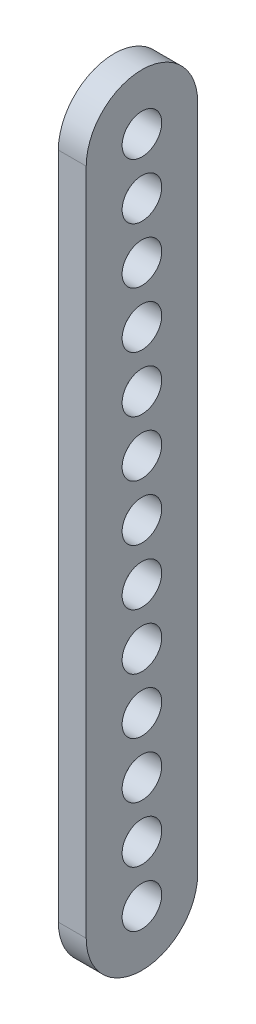
ISO-10303-21;
HEADER;
FILE_DESCRIPTION(('STEP AP214'),'2;1');
FILE_NAME('part.step','',(''),(''),'','','');
FILE_SCHEMA(('AUTOMOTIVE_DESIGN { 1 0 10303 214 1 1 1 1 }'));
ENDSEC;
DATA;
#1=APPLICATION_CONTEXT('core data for automotive mechanical design processes');
#2=APPLICATION_PROTOCOL_DEFINITION('international standard','automotive_design',2000,#1);
#3=PRODUCT_CONTEXT('',#1,'mechanical');
#4=PRODUCT('Part','Part','',(#3));
#5=PRODUCT_RELATED_PRODUCT_CATEGORY('part','',(#4));
#6=PRODUCT_DEFINITION_FORMATION('','',#4);
#7=PRODUCT_DEFINITION_CONTEXT('part definition',#1,'design');
#8=PRODUCT_DEFINITION('design','',#6,#7);
#9=PRODUCT_DEFINITION_SHAPE('','',#8);
#10=(LENGTH_UNIT() NAMED_UNIT(*) SI_UNIT(.MILLI.,.METRE.));
#11=(NAMED_UNIT(*) PLANE_ANGLE_UNIT() SI_UNIT($,.RADIAN.));
#12=(NAMED_UNIT(*) SI_UNIT($,.STERADIAN.) SOLID_ANGLE_UNIT());
#13=UNCERTAINTY_MEASURE_WITH_UNIT(LENGTH_MEASURE(1.E-05),#10,'distance_accuracy_value','');
#14=(GEOMETRIC_REPRESENTATION_CONTEXT(3) GLOBAL_UNCERTAINTY_ASSIGNED_CONTEXT((#13)) GLOBAL_UNIT_ASSIGNED_CONTEXT((#10,
#11,#12)) REPRESENTATION_CONTEXT('',''));
#15=CARTESIAN_POINT('',(0.,0.,0.));
#16=DIRECTION('',(0.,0.,1.));
#17=DIRECTION('',(1.,0.,0.));
#18=AXIS2_PLACEMENT_3D('',#15,#16,#17);
#19=CARTESIAN_POINT('',(2.5,30.,0.));
#20=DIRECTION('',(-1.,0.,0.));
#21=DIRECTION('',(0.,0.,1.));
#22=AXIS2_PLACEMENT_3D('',#19,#20,#21);
#23=CYLINDRICAL_SURFACE('',#22,5.);
#24=CARTESIAN_POINT('',(0.,30.,0.));
#25=DIRECTION('',(1.,0.,0.));
#26=DIRECTION('',(0.,0.,-1.));
#27=AXIS2_PLACEMENT_3D('',#24,#25,#26);
#28=CIRCLE('',#27,5.);
#29=CARTESIAN_POINT('',(0.,30.,-4.99999999999999));
#30=VERTEX_POINT('',#29);
#31=CARTESIAN_POINT('',(0.,30.,5.00000000000001));
#32=VERTEX_POINT('',#31);
#33=EDGE_CURVE('E107',#30,#32,#28,.T.);
#34=ORIENTED_EDGE('',*,*,#33,.T.);
#35=DIRECTION('',(-1.,0.,0.));
#36=VECTOR('',#35,1.);
#37=CARTESIAN_POINT('',(2.5,30.,5.00000000000001));
#38=LINE('',#37,#36);
#39=CARTESIAN_POINT('',(2.5,30.,5.00000000000001));
#40=VERTEX_POINT('',#39);
#41=EDGE_CURVE('E11',#40,#32,#38,.T.);
#42=ORIENTED_EDGE('',*,*,#41,.F.);
#43=CARTESIAN_POINT('',(2.5,30.,0.));
#44=DIRECTION('',(1.,0.,0.));
#45=DIRECTION('',(0.,0.,-1.));
#46=AXIS2_PLACEMENT_3D('',#43,#44,#45);
#47=CIRCLE('',#46,5.);
#48=CARTESIAN_POINT('',(2.5,30.,-4.99999999999999));
#49=VERTEX_POINT('',#48);
#50=EDGE_CURVE('E91',#49,#40,#47,.T.);
#51=ORIENTED_EDGE('',*,*,#50,.F.);
#52=DIRECTION('',(-1.,0.,0.));
#53=VECTOR('',#52,1.);
#54=CARTESIAN_POINT('',(2.5,30.,-4.99999999999999));
#55=LINE('',#54,#53);
#56=EDGE_CURVE('E103',#49,#30,#55,.T.);
#57=ORIENTED_EDGE('',*,*,#56,.T.);
#58=EDGE_LOOP('',(#34,#42,#51,#57));
#59=FACE_BOUND('',#58,.T.);
#60=ADVANCED_FACE('F39',(#59),#23,.T.);
#61=CARTESIAN_POINT('',(2.5,30.,5.00000000000001));
#62=DIRECTION('',(0.,0.,-1.));
#63=DIRECTION('',(0.,1.,0.));
#64=AXIS2_PLACEMENT_3D('',#61,#62,#63);
#65=PLANE('',#64);
#66=DIRECTION('',(0.,-1.,0.));
#67=VECTOR('',#66,1.);
#68=CARTESIAN_POINT('',(0.,30.,5.00000000000001));
#69=LINE('',#68,#67);
#70=CARTESIAN_POINT('',(0.,-30.,4.99999999999999));
#71=VERTEX_POINT('',#70);
#72=EDGE_CURVE('E96',#32,#71,#69,.T.);
#73=ORIENTED_EDGE('',*,*,#72,.T.);
#74=DIRECTION('',(-1.,0.,0.));
#75=VECTOR('',#74,1.);
#76=CARTESIAN_POINT('',(2.5,-30.,4.99999999999999));
#77=LINE('',#76,#75);
#78=CARTESIAN_POINT('',(2.5,-30.,4.99999999999999));
#79=VERTEX_POINT('',#78);
#80=EDGE_CURVE('E48',#79,#71,#77,.T.);
#81=ORIENTED_EDGE('',*,*,#80,.F.);
#82=DIRECTION('',(0.,-1.,0.));
#83=VECTOR('',#82,1.);
#84=CARTESIAN_POINT('',(2.5,30.,5.00000000000001));
#85=LINE('',#84,#83);
#86=EDGE_CURVE('E86',#40,#79,#85,.T.);
#87=ORIENTED_EDGE('',*,*,#86,.F.);
#88=ORIENTED_EDGE('',*,*,#41,.T.);
#89=EDGE_LOOP('',(#73,#81,#87,#88));
#90=FACE_BOUND('',#89,.T.);
#91=ADVANCED_FACE('F95',(#90),#65,.F.);
#92=CARTESIAN_POINT('',(2.5,-30.,0.));
#93=DIRECTION('',(-1.,0.,0.));
#94=DIRECTION('',(0.,0.,1.));
#95=AXIS2_PLACEMENT_3D('',#92,#93,#94);
#96=CYLINDRICAL_SURFACE('',#95,5.);
#97=CARTESIAN_POINT('',(0.,-30.,0.));
#98=DIRECTION('',(1.,0.,0.));
#99=DIRECTION('',(0.,0.,-1.));
#100=AXIS2_PLACEMENT_3D('',#97,#98,#99);
#101=CIRCLE('',#100,5.);
#102=CARTESIAN_POINT('',(0.,-30.,-5.00000000000001));
#103=VERTEX_POINT('',#102);
#104=EDGE_CURVE('E73',#71,#103,#101,.T.);
#105=ORIENTED_EDGE('',*,*,#104,.T.);
#106=DIRECTION('',(-1.,0.,0.));
#107=VECTOR('',#106,1.);
#108=CARTESIAN_POINT('',(2.5,-30.,-5.00000000000001));
#109=LINE('',#108,#107);
#110=CARTESIAN_POINT('',(2.5,-30.,-5.00000000000001));
#111=VERTEX_POINT('',#110);
#112=EDGE_CURVE('E98',#111,#103,#109,.T.);
#113=ORIENTED_EDGE('',*,*,#112,.F.);
#114=CARTESIAN_POINT('',(2.5,-30.,0.));
#115=DIRECTION('',(1.,0.,0.));
#116=DIRECTION('',(0.,0.,-1.));
#117=AXIS2_PLACEMENT_3D('',#114,#115,#116);
#118=CIRCLE('',#117,5.);
#119=EDGE_CURVE('E89',#79,#111,#118,.T.);
#120=ORIENTED_EDGE('',*,*,#119,.F.);
#121=ORIENTED_EDGE('',*,*,#80,.T.);
#122=EDGE_LOOP('',(#105,#113,#120,#121));
#123=FACE_BOUND('',#122,.T.);
#124=ADVANCED_FACE('F99',(#123),#96,.T.);
#125=CARTESIAN_POINT('',(2.5,30.,-4.99999999999999));
#126=DIRECTION('',(0.,0.,1.));
#127=DIRECTION('',(0.,-1.,0.));
#128=AXIS2_PLACEMENT_3D('',#125,#126,#127);
#129=PLANE('',#128);
#130=DIRECTION('',(0.,1.,0.));
#131=VECTOR('',#130,1.);
#132=CARTESIAN_POINT('',(0.,30.,-4.99999999999999));
#133=LINE('',#132,#131);
#134=EDGE_CURVE('E79',#103,#30,#133,.T.);
#135=ORIENTED_EDGE('',*,*,#134,.T.);
#136=ORIENTED_EDGE('',*,*,#56,.F.);
#137=DIRECTION('',(0.,1.,0.));
#138=VECTOR('',#137,1.);
#139=CARTESIAN_POINT('',(2.5,30.,-4.99999999999999));
#140=LINE('',#139,#138);
#141=EDGE_CURVE('E56',#111,#49,#140,.T.);
#142=ORIENTED_EDGE('',*,*,#141,.F.);
#143=ORIENTED_EDGE('',*,*,#112,.T.);
#144=EDGE_LOOP('',(#135,#136,#142,#143));
#145=FACE_BOUND('',#144,.T.);
#146=ADVANCED_FACE('F121',(#145),#129,.F.);
#147=CARTESIAN_POINT('',(2.5,30.,0.));
#148=DIRECTION('',(1.,0.,0.));
#149=DIRECTION('',(0.,0.,-1.));
#150=AXIS2_PLACEMENT_3D('',#147,#148,#149);
#151=PLANE('',#150);
#152=CARTESIAN_POINT('',(2.5,-30.,0.));
#153=DIRECTION('',(1.,0.,0.));
#154=DIRECTION('',(0.,0.,-1.));
#155=AXIS2_PLACEMENT_3D('',#152,#153,#154);
#156=CIRCLE('',#155,1.77799999999999);
#157=CARTESIAN_POINT('',(2.5,-30.,-1.77799999999999));
#158=VERTEX_POINT('',#157);
#159=EDGE_CURVE('E227',#158,#158,#156,.T.);
#160=ORIENTED_EDGE('',*,*,#159,.F.);
#161=EDGE_LOOP('',(#160));
#162=FACE_BOUND('',#161,.T.);
#163=CARTESIAN_POINT('',(2.5,-25.,0.));
#164=DIRECTION('',(1.,0.,0.));
#165=DIRECTION('',(0.,0.,-1.));
#166=AXIS2_PLACEMENT_3D('',#163,#164,#165);
#167=CIRCLE('',#166,1.77799999999999);
#168=CARTESIAN_POINT('',(2.5,-25.,-1.77799999999999));
#169=VERTEX_POINT('',#168);
#170=EDGE_CURVE('E219',#169,#169,#167,.T.);
#171=ORIENTED_EDGE('',*,*,#170,.F.);
#172=EDGE_LOOP('',(#171));
#173=FACE_BOUND('',#172,.T.);
#174=CARTESIAN_POINT('',(2.5,-20.,0.));
#175=DIRECTION('',(1.,0.,0.));
#176=DIRECTION('',(0.,0.,-1.));
#177=AXIS2_PLACEMENT_3D('',#174,#175,#176);
#178=CIRCLE('',#177,1.77799999999999);
#179=CARTESIAN_POINT('',(2.5,-20.,-1.77799999999999));
#180=VERTEX_POINT('',#179);
#181=EDGE_CURVE('E211',#180,#180,#178,.T.);
#182=ORIENTED_EDGE('',*,*,#181,.F.);
#183=EDGE_LOOP('',(#182));
#184=FACE_BOUND('',#183,.T.);
#185=CARTESIAN_POINT('',(2.5,-15.,0.));
#186=DIRECTION('',(1.,0.,0.));
#187=DIRECTION('',(0.,0.,-1.));
#188=AXIS2_PLACEMENT_3D('',#185,#186,#187);
#189=CIRCLE('',#188,1.77799999999999);
#190=CARTESIAN_POINT('',(2.5,-15.,-1.77799999999999));
#191=VERTEX_POINT('',#190);
#192=EDGE_CURVE('E203',#191,#191,#189,.T.);
#193=ORIENTED_EDGE('',*,*,#192,.F.);
#194=EDGE_LOOP('',(#193));
#195=FACE_BOUND('',#194,.T.);
#196=CARTESIAN_POINT('',(2.5,-10.,0.));
#197=DIRECTION('',(1.,0.,0.));
#198=DIRECTION('',(0.,0.,-1.));
#199=AXIS2_PLACEMENT_3D('',#196,#197,#198);
#200=CIRCLE('',#199,1.77799999999999);
#201=CARTESIAN_POINT('',(2.5,-10.,-1.77799999999999));
#202=VERTEX_POINT('',#201);
#203=EDGE_CURVE('E195',#202,#202,#200,.T.);
#204=ORIENTED_EDGE('',*,*,#203,.F.);
#205=EDGE_LOOP('',(#204));
#206=FACE_BOUND('',#205,.T.);
#207=CARTESIAN_POINT('',(2.5,-5.,0.));
#208=DIRECTION('',(1.,0.,0.));
#209=DIRECTION('',(0.,0.,-1.));
#210=AXIS2_PLACEMENT_3D('',#207,#208,#209);
#211=CIRCLE('',#210,1.77799999999999);
#212=CARTESIAN_POINT('',(2.5,-5.,-1.77799999999999));
#213=VERTEX_POINT('',#212);
#214=EDGE_CURVE('E187',#213,#213,#211,.T.);
#215=ORIENTED_EDGE('',*,*,#214,.F.);
#216=EDGE_LOOP('',(#215));
#217=FACE_BOUND('',#216,.T.);
#218=CARTESIAN_POINT('',(2.5,30.,0.));
#219=DIRECTION('',(1.,0.,0.));
#220=DIRECTION('',(0.,0.,-1.));
#221=AXIS2_PLACEMENT_3D('',#218,#219,#220);
#222=CIRCLE('',#221,1.77799999999999);
#223=CARTESIAN_POINT('',(2.5,30.,-1.77799999999999));
#224=VERTEX_POINT('',#223);
#225=EDGE_CURVE('E179',#224,#224,#222,.T.);
#226=ORIENTED_EDGE('',*,*,#225,.F.);
#227=EDGE_LOOP('',(#226));
#228=FACE_BOUND('',#227,.T.);
#229=CARTESIAN_POINT('',(2.5,25.,0.));
#230=DIRECTION('',(1.,0.,0.));
#231=DIRECTION('',(0.,0.,-1.));
#232=AXIS2_PLACEMENT_3D('',#229,#230,#231);
#233=CIRCLE('',#232,1.77799999999999);
#234=CARTESIAN_POINT('',(2.5,25.,-1.77799999999999));
#235=VERTEX_POINT('',#234);
#236=EDGE_CURVE('E171',#235,#235,#233,.T.);
#237=ORIENTED_EDGE('',*,*,#236,.F.);
#238=EDGE_LOOP('',(#237));
#239=FACE_BOUND('',#238,.T.);
#240=CARTESIAN_POINT('',(2.5,20.,0.));
#241=DIRECTION('',(1.,0.,0.));
#242=DIRECTION('',(0.,0.,-1.));
#243=AXIS2_PLACEMENT_3D('',#240,#241,#242);
#244=CIRCLE('',#243,1.77799999999999);
#245=CARTESIAN_POINT('',(2.5,20.,-1.77799999999999));
#246=VERTEX_POINT('',#245);
#247=EDGE_CURVE('E163',#246,#246,#244,.T.);
#248=ORIENTED_EDGE('',*,*,#247,.F.);
#249=EDGE_LOOP('',(#248));
#250=FACE_BOUND('',#249,.T.);
#251=CARTESIAN_POINT('',(2.5,15.,0.));
#252=DIRECTION('',(1.,0.,0.));
#253=DIRECTION('',(0.,0.,-1.));
#254=AXIS2_PLACEMENT_3D('',#251,#252,#253);
#255=CIRCLE('',#254,1.77799999999999);
#256=CARTESIAN_POINT('',(2.5,15.,-1.77799999999999));
#257=VERTEX_POINT('',#256);
#258=EDGE_CURVE('E155',#257,#257,#255,.T.);
#259=ORIENTED_EDGE('',*,*,#258,.F.);
#260=EDGE_LOOP('',(#259));
#261=FACE_BOUND('',#260,.T.);
#262=CARTESIAN_POINT('',(2.5,10.,0.));
#263=DIRECTION('',(1.,0.,0.));
#264=DIRECTION('',(0.,0.,-1.));
#265=AXIS2_PLACEMENT_3D('',#262,#263,#264);
#266=CIRCLE('',#265,1.77799999999999);
#267=CARTESIAN_POINT('',(2.5,10.,-1.77799999999999));
#268=VERTEX_POINT('',#267);
#269=EDGE_CURVE('E147',#268,#268,#266,.T.);
#270=ORIENTED_EDGE('',*,*,#269,.F.);
#271=EDGE_LOOP('',(#270));
#272=FACE_BOUND('',#271,.T.);
#273=CARTESIAN_POINT('',(2.5,5.,0.));
#274=DIRECTION('',(1.,0.,0.));
#275=DIRECTION('',(0.,0.,-1.));
#276=AXIS2_PLACEMENT_3D('',#273,#274,#275);
#277=CIRCLE('',#276,1.77799999999999);
#278=CARTESIAN_POINT('',(2.5,5.,-1.77799999999999));
#279=VERTEX_POINT('',#278);
#280=EDGE_CURVE('E139',#279,#279,#277,.T.);
#281=ORIENTED_EDGE('',*,*,#280,.F.);
#282=EDGE_LOOP('',(#281));
#283=FACE_BOUND('',#282,.T.);
#284=CARTESIAN_POINT('',(2.5,0.,0.));
#285=DIRECTION('',(1.,0.,0.));
#286=DIRECTION('',(0.,0.,-1.));
#287=AXIS2_PLACEMENT_3D('',#284,#285,#286);
#288=CIRCLE('',#287,1.77799999999999);
#289=CARTESIAN_POINT('',(2.5,0.,-1.77799999999999));
#290=VERTEX_POINT('',#289);
#291=EDGE_CURVE('E131',#290,#290,#288,.T.);
#292=ORIENTED_EDGE('',*,*,#291,.F.);
#293=EDGE_LOOP('',(#292));
#294=FACE_BOUND('',#293,.T.);
#295=ORIENTED_EDGE('',*,*,#50,.T.);
#296=ORIENTED_EDGE('',*,*,#86,.T.);
#297=ORIENTED_EDGE('',*,*,#119,.T.);
#298=ORIENTED_EDGE('',*,*,#141,.T.);
#299=EDGE_LOOP('',(#295,#296,#297,#298));
#300=FACE_BOUND('',#299,.T.);
#301=ADVANCED_FACE('F87',(#162,#173,#184,#195,#206,#217,#228,#239,#250,#261,#272,#283,#294,
#300),#151,.T.);
#302=CARTESIAN_POINT('',(0.,30.,0.));
#303=DIRECTION('',(1.,0.,0.));
#304=DIRECTION('',(0.,0.,-1.));
#305=AXIS2_PLACEMENT_3D('',#302,#303,#304);
#306=PLANE('',#305);
#307=CARTESIAN_POINT('',(0.,-30.,0.));
#308=DIRECTION('',(1.,0.,0.));
#309=DIRECTION('',(0.,0.,-1.));
#310=AXIS2_PLACEMENT_3D('',#307,#308,#309);
#311=CIRCLE('',#310,1.778);
#312=CARTESIAN_POINT('',(0.,-30.,-1.778));
#313=VERTEX_POINT('',#312);
#314=EDGE_CURVE('E223',#313,#313,#311,.T.);
#315=ORIENTED_EDGE('',*,*,#314,.T.);
#316=EDGE_LOOP('',(#315));
#317=FACE_BOUND('',#316,.T.);
#318=CARTESIAN_POINT('',(0.,-25.,0.));
#319=DIRECTION('',(1.,0.,0.));
#320=DIRECTION('',(0.,0.,-1.));
#321=AXIS2_PLACEMENT_3D('',#318,#319,#320);
#322=CIRCLE('',#321,1.778);
#323=CARTESIAN_POINT('',(0.,-25.,-1.778));
#324=VERTEX_POINT('',#323);
#325=EDGE_CURVE('E215',#324,#324,#322,.T.);
#326=ORIENTED_EDGE('',*,*,#325,.T.);
#327=EDGE_LOOP('',(#326));
#328=FACE_BOUND('',#327,.T.);
#329=CARTESIAN_POINT('',(0.,-20.,0.));
#330=DIRECTION('',(1.,0.,0.));
#331=DIRECTION('',(0.,0.,-1.));
#332=AXIS2_PLACEMENT_3D('',#329,#330,#331);
#333=CIRCLE('',#332,1.778);
#334=CARTESIAN_POINT('',(0.,-20.,-1.778));
#335=VERTEX_POINT('',#334);
#336=EDGE_CURVE('E207',#335,#335,#333,.T.);
#337=ORIENTED_EDGE('',*,*,#336,.T.);
#338=EDGE_LOOP('',(#337));
#339=FACE_BOUND('',#338,.T.);
#340=CARTESIAN_POINT('',(0.,-15.,0.));
#341=DIRECTION('',(1.,0.,0.));
#342=DIRECTION('',(0.,0.,-1.));
#343=AXIS2_PLACEMENT_3D('',#340,#341,#342);
#344=CIRCLE('',#343,1.778);
#345=CARTESIAN_POINT('',(0.,-15.,-1.778));
#346=VERTEX_POINT('',#345);
#347=EDGE_CURVE('E199',#346,#346,#344,.T.);
#348=ORIENTED_EDGE('',*,*,#347,.T.);
#349=EDGE_LOOP('',(#348));
#350=FACE_BOUND('',#349,.T.);
#351=CARTESIAN_POINT('',(0.,-10.,0.));
#352=DIRECTION('',(1.,0.,0.));
#353=DIRECTION('',(0.,0.,-1.));
#354=AXIS2_PLACEMENT_3D('',#351,#352,#353);
#355=CIRCLE('',#354,1.778);
#356=CARTESIAN_POINT('',(0.,-10.,-1.778));
#357=VERTEX_POINT('',#356);
#358=EDGE_CURVE('E191',#357,#357,#355,.T.);
#359=ORIENTED_EDGE('',*,*,#358,.T.);
#360=EDGE_LOOP('',(#359));
#361=FACE_BOUND('',#360,.T.);
#362=CARTESIAN_POINT('',(0.,-5.,0.));
#363=DIRECTION('',(1.,0.,0.));
#364=DIRECTION('',(0.,0.,-1.));
#365=AXIS2_PLACEMENT_3D('',#362,#363,#364);
#366=CIRCLE('',#365,1.778);
#367=CARTESIAN_POINT('',(0.,-5.,-1.778));
#368=VERTEX_POINT('',#367);
#369=EDGE_CURVE('E183',#368,#368,#366,.T.);
#370=ORIENTED_EDGE('',*,*,#369,.T.);
#371=EDGE_LOOP('',(#370));
#372=FACE_BOUND('',#371,.T.);
#373=CARTESIAN_POINT('',(0.,30.,0.));
#374=DIRECTION('',(1.,0.,0.));
#375=DIRECTION('',(0.,0.,-1.));
#376=AXIS2_PLACEMENT_3D('',#373,#374,#375);
#377=CIRCLE('',#376,1.778);
#378=CARTESIAN_POINT('',(0.,30.,-1.778));
#379=VERTEX_POINT('',#378);
#380=EDGE_CURVE('E175',#379,#379,#377,.T.);
#381=ORIENTED_EDGE('',*,*,#380,.T.);
#382=EDGE_LOOP('',(#381));
#383=FACE_BOUND('',#382,.T.);
#384=CARTESIAN_POINT('',(0.,25.,0.));
#385=DIRECTION('',(1.,0.,0.));
#386=DIRECTION('',(0.,0.,-1.));
#387=AXIS2_PLACEMENT_3D('',#384,#385,#386);
#388=CIRCLE('',#387,1.778);
#389=CARTESIAN_POINT('',(0.,25.,-1.778));
#390=VERTEX_POINT('',#389);
#391=EDGE_CURVE('E167',#390,#390,#388,.T.);
#392=ORIENTED_EDGE('',*,*,#391,.T.);
#393=EDGE_LOOP('',(#392));
#394=FACE_BOUND('',#393,.T.);
#395=CARTESIAN_POINT('',(0.,20.,0.));
#396=DIRECTION('',(1.,0.,0.));
#397=DIRECTION('',(0.,0.,-1.));
#398=AXIS2_PLACEMENT_3D('',#395,#396,#397);
#399=CIRCLE('',#398,1.778);
#400=CARTESIAN_POINT('',(0.,20.,-1.778));
#401=VERTEX_POINT('',#400);
#402=EDGE_CURVE('E159',#401,#401,#399,.T.);
#403=ORIENTED_EDGE('',*,*,#402,.T.);
#404=EDGE_LOOP('',(#403));
#405=FACE_BOUND('',#404,.T.);
#406=CARTESIAN_POINT('',(0.,15.,0.));
#407=DIRECTION('',(1.,0.,0.));
#408=DIRECTION('',(0.,0.,-1.));
#409=AXIS2_PLACEMENT_3D('',#406,#407,#408);
#410=CIRCLE('',#409,1.778);
#411=CARTESIAN_POINT('',(0.,15.,-1.778));
#412=VERTEX_POINT('',#411);
#413=EDGE_CURVE('E151',#412,#412,#410,.T.);
#414=ORIENTED_EDGE('',*,*,#413,.T.);
#415=EDGE_LOOP('',(#414));
#416=FACE_BOUND('',#415,.T.);
#417=CARTESIAN_POINT('',(0.,10.,0.));
#418=DIRECTION('',(1.,0.,0.));
#419=DIRECTION('',(0.,0.,-1.));
#420=AXIS2_PLACEMENT_3D('',#417,#418,#419);
#421=CIRCLE('',#420,1.778);
#422=CARTESIAN_POINT('',(0.,10.,-1.778));
#423=VERTEX_POINT('',#422);
#424=EDGE_CURVE('E143',#423,#423,#421,.T.);
#425=ORIENTED_EDGE('',*,*,#424,.T.);
#426=EDGE_LOOP('',(#425));
#427=FACE_BOUND('',#426,.T.);
#428=CARTESIAN_POINT('',(0.,5.,0.));
#429=DIRECTION('',(1.,0.,0.));
#430=DIRECTION('',(0.,0.,-1.));
#431=AXIS2_PLACEMENT_3D('',#428,#429,#430);
#432=CIRCLE('',#431,1.778);
#433=CARTESIAN_POINT('',(0.,5.,-1.778));
#434=VERTEX_POINT('',#433);
#435=EDGE_CURVE('E135',#434,#434,#432,.T.);
#436=ORIENTED_EDGE('',*,*,#435,.T.);
#437=EDGE_LOOP('',(#436));
#438=FACE_BOUND('',#437,.T.);
#439=CARTESIAN_POINT('',(0.,0.,0.));
#440=DIRECTION('',(1.,0.,0.));
#441=DIRECTION('',(0.,0.,-1.));
#442=AXIS2_PLACEMENT_3D('',#439,#440,#441);
#443=CIRCLE('',#442,1.77799999999999);
#444=CARTESIAN_POINT('',(0.,0.,-1.77799999999999));
#445=VERTEX_POINT('',#444);
#446=EDGE_CURVE('E111',#445,#445,#443,.T.);
#447=ORIENTED_EDGE('',*,*,#446,.T.);
#448=EDGE_LOOP('',(#447));
#449=FACE_BOUND('',#448,.T.);
#450=ORIENTED_EDGE('',*,*,#33,.F.);
#451=ORIENTED_EDGE('',*,*,#134,.F.);
#452=ORIENTED_EDGE('',*,*,#104,.F.);
#453=ORIENTED_EDGE('',*,*,#72,.F.);
#454=EDGE_LOOP('',(#450,#451,#452,#453));
#455=FACE_BOUND('',#454,.T.);
#456=ADVANCED_FACE('F124',(#317,#328,#339,#350,#361,#372,#383,#394,#405,#416,#427,#438,#449,
#455),#306,.F.);
#457=CARTESIAN_POINT('',(2.5,0.,0.));
#458=DIRECTION('',(1.,0.,0.));
#459=DIRECTION('',(0.,0.,-1.));
#460=AXIS2_PLACEMENT_3D('',#457,#458,#459);
#461=CYLINDRICAL_SURFACE('',#460,1.77799999999999);
#462=ORIENTED_EDGE('',*,*,#446,.F.);
#463=EDGE_LOOP('',(#462));
#464=FACE_BOUND('',#463,.T.);
#465=ORIENTED_EDGE('',*,*,#291,.T.);
#466=EDGE_LOOP('',(#465));
#467=FACE_BOUND('',#466,.T.);
#468=ADVANCED_FACE('F261',(#464,#467),#461,.F.);
#469=CARTESIAN_POINT('',(2.5,5.,0.));
#470=DIRECTION('',(1.,0.,0.));
#471=DIRECTION('',(0.,0.,-1.));
#472=AXIS2_PLACEMENT_3D('',#469,#470,#471);
#473=CYLINDRICAL_SURFACE('',#472,1.77799999999999);
#474=ORIENTED_EDGE('',*,*,#435,.F.);
#475=EDGE_LOOP('',(#474));
#476=FACE_BOUND('',#475,.T.);
#477=ORIENTED_EDGE('',*,*,#280,.T.);
#478=EDGE_LOOP('',(#477));
#479=FACE_BOUND('',#478,.T.);
#480=ADVANCED_FACE('F263',(#476,#479),#473,.F.);
#481=CARTESIAN_POINT('',(2.5,10.,0.));
#482=DIRECTION('',(1.,0.,0.));
#483=DIRECTION('',(0.,0.,-1.));
#484=AXIS2_PLACEMENT_3D('',#481,#482,#483);
#485=CYLINDRICAL_SURFACE('',#484,1.77799999999999);
#486=ORIENTED_EDGE('',*,*,#424,.F.);
#487=EDGE_LOOP('',(#486));
#488=FACE_BOUND('',#487,.T.);
#489=ORIENTED_EDGE('',*,*,#269,.T.);
#490=EDGE_LOOP('',(#489));
#491=FACE_BOUND('',#490,.T.);
#492=ADVANCED_FACE('F270',(#488,#491),#485,.F.);
#493=CARTESIAN_POINT('',(2.5,15.,0.));
#494=DIRECTION('',(1.,0.,0.));
#495=DIRECTION('',(0.,0.,-1.));
#496=AXIS2_PLACEMENT_3D('',#493,#494,#495);
#497=CYLINDRICAL_SURFACE('',#496,1.77799999999999);
#498=ORIENTED_EDGE('',*,*,#413,.F.);
#499=EDGE_LOOP('',(#498));
#500=FACE_BOUND('',#499,.T.);
#501=ORIENTED_EDGE('',*,*,#258,.T.);
#502=EDGE_LOOP('',(#501));
#503=FACE_BOUND('',#502,.T.);
#504=ADVANCED_FACE('F377',(#500,#503),#497,.F.);
#505=CARTESIAN_POINT('',(2.5,20.,0.));
#506=DIRECTION('',(1.,0.,0.));
#507=DIRECTION('',(0.,0.,-1.));
#508=AXIS2_PLACEMENT_3D('',#505,#506,#507);
#509=CYLINDRICAL_SURFACE('',#508,1.77799999999999);
#510=ORIENTED_EDGE('',*,*,#402,.F.);
#511=EDGE_LOOP('',(#510));
#512=FACE_BOUND('',#511,.T.);
#513=ORIENTED_EDGE('',*,*,#247,.T.);
#514=EDGE_LOOP('',(#513));
#515=FACE_BOUND('',#514,.T.);
#516=ADVANCED_FACE('F373',(#512,#515),#509,.F.);
#517=CARTESIAN_POINT('',(2.5,25.,0.));
#518=DIRECTION('',(1.,0.,0.));
#519=DIRECTION('',(0.,0.,-1.));
#520=AXIS2_PLACEMENT_3D('',#517,#518,#519);
#521=CYLINDRICAL_SURFACE('',#520,1.77799999999999);
#522=ORIENTED_EDGE('',*,*,#391,.F.);
#523=EDGE_LOOP('',(#522));
#524=FACE_BOUND('',#523,.T.);
#525=ORIENTED_EDGE('',*,*,#236,.T.);
#526=EDGE_LOOP('',(#525));
#527=FACE_BOUND('',#526,.T.);
#528=ADVANCED_FACE('F369',(#524,#527),#521,.F.);
#529=CARTESIAN_POINT('',(2.5,30.,0.));
#530=DIRECTION('',(1.,0.,0.));
#531=DIRECTION('',(0.,0.,-1.));
#532=AXIS2_PLACEMENT_3D('',#529,#530,#531);
#533=CYLINDRICAL_SURFACE('',#532,1.77799999999999);
#534=ORIENTED_EDGE('',*,*,#380,.F.);
#535=EDGE_LOOP('',(#534));
#536=FACE_BOUND('',#535,.T.);
#537=ORIENTED_EDGE('',*,*,#225,.T.);
#538=EDGE_LOOP('',(#537));
#539=FACE_BOUND('',#538,.T.);
#540=ADVANCED_FACE('F311',(#536,#539),#533,.F.);
#541=CARTESIAN_POINT('',(2.5,-5.,0.));
#542=DIRECTION('',(1.,0.,0.));
#543=DIRECTION('',(0.,0.,-1.));
#544=AXIS2_PLACEMENT_3D('',#541,#542,#543);
#545=CYLINDRICAL_SURFACE('',#544,1.77799999999999);
#546=ORIENTED_EDGE('',*,*,#369,.F.);
#547=EDGE_LOOP('',(#546));
#548=FACE_BOUND('',#547,.T.);
#549=ORIENTED_EDGE('',*,*,#214,.T.);
#550=EDGE_LOOP('',(#549));
#551=FACE_BOUND('',#550,.T.);
#552=ADVANCED_FACE('F305',(#548,#551),#545,.F.);
#553=CARTESIAN_POINT('',(2.5,-10.,0.));
#554=DIRECTION('',(1.,0.,0.));
#555=DIRECTION('',(0.,0.,-1.));
#556=AXIS2_PLACEMENT_3D('',#553,#554,#555);
#557=CYLINDRICAL_SURFACE('',#556,1.77799999999999);
#558=ORIENTED_EDGE('',*,*,#358,.F.);
#559=EDGE_LOOP('',(#558));
#560=FACE_BOUND('',#559,.T.);
#561=ORIENTED_EDGE('',*,*,#203,.T.);
#562=EDGE_LOOP('',(#561));
#563=FACE_BOUND('',#562,.T.);
#564=ADVANCED_FACE('F310',(#560,#563),#557,.F.);
#565=CARTESIAN_POINT('',(2.5,-15.,0.));
#566=DIRECTION('',(1.,0.,0.));
#567=DIRECTION('',(0.,0.,-1.));
#568=AXIS2_PLACEMENT_3D('',#565,#566,#567);
#569=CYLINDRICAL_SURFACE('',#568,1.77799999999999);
#570=ORIENTED_EDGE('',*,*,#347,.F.);
#571=EDGE_LOOP('',(#570));
#572=FACE_BOUND('',#571,.T.);
#573=ORIENTED_EDGE('',*,*,#192,.T.);
#574=EDGE_LOOP('',(#573));
#575=FACE_BOUND('',#574,.T.);
#576=ADVANCED_FACE('F323',(#572,#575),#569,.F.);
#577=CARTESIAN_POINT('',(2.5,-20.,0.));
#578=DIRECTION('',(1.,0.,0.));
#579=DIRECTION('',(0.,0.,-1.));
#580=AXIS2_PLACEMENT_3D('',#577,#578,#579);
#581=CYLINDRICAL_SURFACE('',#580,1.77799999999999);
#582=ORIENTED_EDGE('',*,*,#336,.F.);
#583=EDGE_LOOP('',(#582));
#584=FACE_BOUND('',#583,.T.);
#585=ORIENTED_EDGE('',*,*,#181,.T.);
#586=EDGE_LOOP('',(#585));
#587=FACE_BOUND('',#586,.T.);
#588=ADVANCED_FACE('F333',(#584,#587),#581,.F.);
#589=CARTESIAN_POINT('',(2.5,-25.,0.));
#590=DIRECTION('',(1.,0.,0.));
#591=DIRECTION('',(0.,0.,-1.));
#592=AXIS2_PLACEMENT_3D('',#589,#590,#591);
#593=CYLINDRICAL_SURFACE('',#592,1.77799999999999);
#594=ORIENTED_EDGE('',*,*,#325,.F.);
#595=EDGE_LOOP('',(#594));
#596=FACE_BOUND('',#595,.T.);
#597=ORIENTED_EDGE('',*,*,#170,.T.);
#598=EDGE_LOOP('',(#597));
#599=FACE_BOUND('',#598,.T.);
#600=ADVANCED_FACE('F343',(#596,#599),#593,.F.);
#601=CARTESIAN_POINT('',(2.5,-30.,0.));
#602=DIRECTION('',(1.,0.,0.));
#603=DIRECTION('',(0.,0.,-1.));
#604=AXIS2_PLACEMENT_3D('',#601,#602,#603);
#605=CYLINDRICAL_SURFACE('',#604,1.77799999999999);
#606=ORIENTED_EDGE('',*,*,#314,.F.);
#607=EDGE_LOOP('',(#606));
#608=FACE_BOUND('',#607,.T.);
#609=ORIENTED_EDGE('',*,*,#159,.T.);
#610=EDGE_LOOP('',(#609));
#611=FACE_BOUND('',#610,.T.);
#612=ADVANCED_FACE('F232',(#608,#611),#605,.F.);
#613=CLOSED_SHELL('',(#60,#91,#124,#146,#301,#456,#468,#480,#492,#504,#516,#528,#540,#552,#564,
#576,#588,#600,#612));
#614=MANIFOLD_SOLID_BREP('B2',#613);
#615=ADVANCED_BREP_SHAPE_REPRESENTATION('',(#18,#614),#14);
#616=SHAPE_DEFINITION_REPRESENTATION(#9,#615);
ENDSEC;
END-ISO-10303-21;
